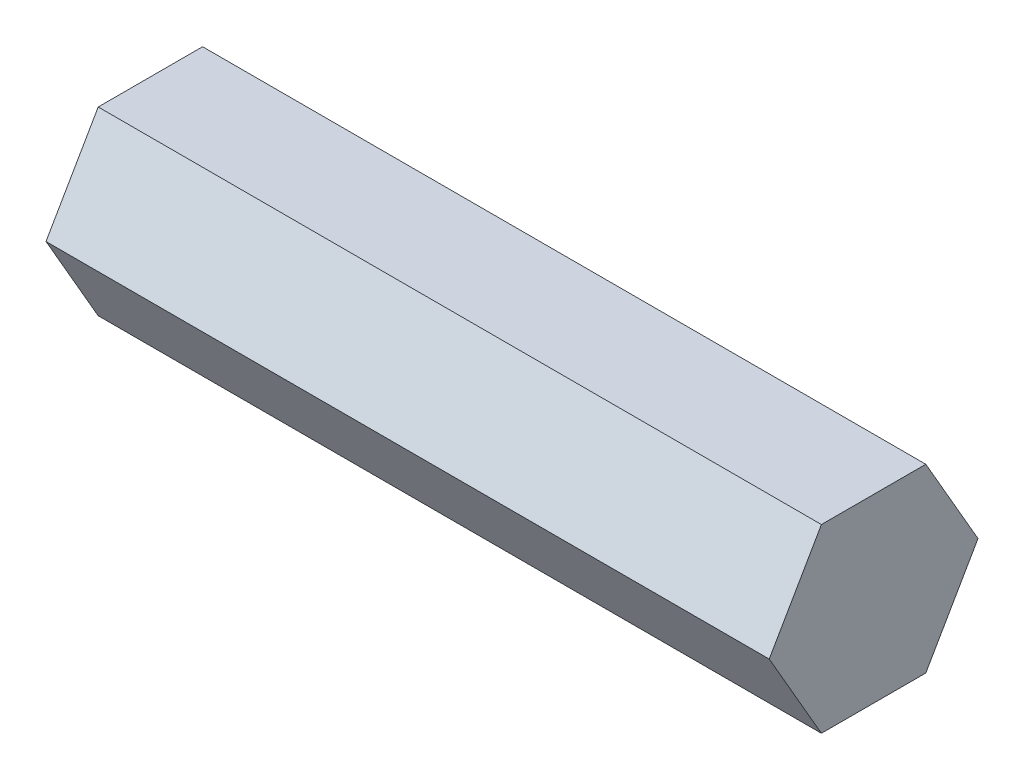
ISO-10303-21;
HEADER;
FILE_DESCRIPTION(('STEP AP214'),'2;1');
FILE_NAME('part.step','',(''),(''),'','','');
FILE_SCHEMA(('AUTOMOTIVE_DESIGN { 1 0 10303 214 1 1 1 1 }'));
ENDSEC;
DATA;
#1=APPLICATION_CONTEXT('core data for automotive mechanical design processes');
#2=APPLICATION_PROTOCOL_DEFINITION('international standard','automotive_design',2000,#1);
#3=PRODUCT_CONTEXT('',#1,'mechanical');
#4=PRODUCT('Part','Part','',(#3));
#5=PRODUCT_RELATED_PRODUCT_CATEGORY('part','',(#4));
#6=PRODUCT_DEFINITION_FORMATION('','',#4);
#7=PRODUCT_DEFINITION_CONTEXT('part definition',#1,'design');
#8=PRODUCT_DEFINITION('design','',#6,#7);
#9=PRODUCT_DEFINITION_SHAPE('','',#8);
#10=(LENGTH_UNIT() NAMED_UNIT(*) SI_UNIT(.MILLI.,.METRE.));
#11=(NAMED_UNIT(*) PLANE_ANGLE_UNIT() SI_UNIT($,.RADIAN.));
#12=(NAMED_UNIT(*) SI_UNIT($,.STERADIAN.) SOLID_ANGLE_UNIT());
#13=UNCERTAINTY_MEASURE_WITH_UNIT(LENGTH_MEASURE(1.E-05),#10,'distance_accuracy_value','');
#14=(GEOMETRIC_REPRESENTATION_CONTEXT(3) GLOBAL_UNCERTAINTY_ASSIGNED_CONTEXT((#13)) GLOBAL_UNIT_ASSIGNED_CONTEXT((#10,
#11,#12)) REPRESENTATION_CONTEXT('',''));
#15=CARTESIAN_POINT('',(0.,0.,0.));
#16=DIRECTION('',(0.,0.,1.));
#17=DIRECTION('',(1.,0.,0.));
#18=AXIS2_PLACEMENT_3D('',#15,#16,#17);
#19=CARTESIAN_POINT('',(50.8,-6.34999999999996,-3.6661742093542));
#20=DIRECTION('',(0.,0.499999999999995,0.866025403784442));
#21=DIRECTION('',(0.,-0.866025403784442,0.499999999999995));
#22=AXIS2_PLACEMENT_3D('',#19,#20,#21);
#23=PLANE('',#22);
#24=DIRECTION('',(0.,0.866025403784441,-0.499999999999995));
#25=VECTOR('',#24,1.);
#26=CARTESIAN_POINT('',(0.,-6.34999999999996,-3.6661742093542));
#27=LINE('',#26,#25);
#28=CARTESIAN_POINT('',(0.,-6.34999999999996,-3.6661742093542));
#29=VERTEX_POINT('',#28);
#30=CARTESIAN_POINT('',(0.,0.,-7.33234841870825));
#31=VERTEX_POINT('',#30);
#32=EDGE_CURVE('E121',#29,#31,#27,.T.);
#33=ORIENTED_EDGE('',*,*,#32,.T.);
#34=DIRECTION('',(-1.,0.,0.));
#35=VECTOR('',#34,1.);
#36=CARTESIAN_POINT('',(50.8,0.,-7.33234841870825));
#37=LINE('',#36,#35);
#38=CARTESIAN_POINT('',(50.8,0.,-7.33234841870825));
#39=VERTEX_POINT('',#38);
#40=EDGE_CURVE('E11',#39,#31,#37,.T.);
#41=ORIENTED_EDGE('',*,*,#40,.F.);
#42=DIRECTION('',(0.,0.866025403784441,-0.499999999999995));
#43=VECTOR('',#42,1.);
#44=CARTESIAN_POINT('',(50.8,-6.34999999999996,-3.6661742093542));
#45=LINE('',#44,#43);
#46=CARTESIAN_POINT('',(50.8,-6.34999999999996,-3.6661742093542));
#47=VERTEX_POINT('',#46);
#48=EDGE_CURVE('E131',#47,#39,#45,.T.);
#49=ORIENTED_EDGE('',*,*,#48,.F.);
#50=DIRECTION('',(-1.,0.,0.));
#51=VECTOR('',#50,1.);
#52=CARTESIAN_POINT('',(50.8,-6.34999999999996,-3.6661742093542));
#53=LINE('',#52,#51);
#54=EDGE_CURVE('E117',#47,#29,#53,.T.);
#55=ORIENTED_EDGE('',*,*,#54,.T.);
#56=EDGE_LOOP('',(#33,#41,#49,#55));
#57=FACE_BOUND('',#56,.T.);
#58=ADVANCED_FACE('F37',(#57),#23,.F.);
#59=CARTESIAN_POINT('',(50.8,0.,-7.33234841870825));
#60=DIRECTION('',(0.,-0.500000000000001,0.866025403784438));
#61=DIRECTION('',(0.,-0.866025403784438,-0.500000000000001));
#62=AXIS2_PLACEMENT_3D('',#59,#60,#61);
#63=PLANE('',#62);
#64=DIRECTION('',(0.,0.866025403784438,0.500000000000001));
#65=VECTOR('',#64,1.);
#66=CARTESIAN_POINT('',(0.,0.,-7.33234841870825));
#67=LINE('',#66,#65);
#68=CARTESIAN_POINT('',(0.,6.35000000000001,-3.66617420935411));
#69=VERTEX_POINT('',#68);
#70=EDGE_CURVE('E124',#31,#69,#67,.T.);
#71=ORIENTED_EDGE('',*,*,#70,.T.);
#72=DIRECTION('',(-1.,0.,0.));
#73=VECTOR('',#72,1.);
#74=CARTESIAN_POINT('',(50.8,6.35000000000001,-3.66617420935411));
#75=LINE('',#74,#73);
#76=CARTESIAN_POINT('',(50.8,6.35000000000001,-3.66617420935411));
#77=VERTEX_POINT('',#76);
#78=EDGE_CURVE('E45',#77,#69,#75,.T.);
#79=ORIENTED_EDGE('',*,*,#78,.F.);
#80=DIRECTION('',(0.,0.866025403784438,0.500000000000001));
#81=VECTOR('',#80,1.);
#82=CARTESIAN_POINT('',(50.8,0.,-7.33234841870825));
#83=LINE('',#82,#81);
#84=EDGE_CURVE('E90',#39,#77,#83,.T.);
#85=ORIENTED_EDGE('',*,*,#84,.F.);
#86=ORIENTED_EDGE('',*,*,#40,.T.);
#87=EDGE_LOOP('',(#71,#79,#85,#86));
#88=FACE_BOUND('',#87,.T.);
#89=ADVANCED_FACE('F155',(#88),#63,.F.);
#90=CARTESIAN_POINT('',(50.8,6.35000000000001,-3.66617420935411));
#91=DIRECTION('',(0.,-1.,0.));
#92=DIRECTION('',(0.,0.,-1.));
#93=AXIS2_PLACEMENT_3D('',#90,#91,#92);
#94=PLANE('',#93);
#95=DIRECTION('',(0.,0.,1.));
#96=VECTOR('',#95,1.);
#97=CARTESIAN_POINT('',(0.,6.35000000000001,-3.66617420935411));
#98=LINE('',#97,#96);
#99=CARTESIAN_POINT('',(0.,6.34999999999999,3.66617420935415));
#100=VERTEX_POINT('',#99);
#101=EDGE_CURVE('E126',#69,#100,#98,.T.);
#102=ORIENTED_EDGE('',*,*,#101,.T.);
#103=DIRECTION('',(-1.,0.,0.));
#104=VECTOR('',#103,1.);
#105=CARTESIAN_POINT('',(50.8,6.34999999999999,3.66617420935415));
#106=LINE('',#105,#104);
#107=CARTESIAN_POINT('',(50.8,6.34999999999999,3.66617420935415));
#108=VERTEX_POINT('',#107);
#109=EDGE_CURVE('E112',#108,#100,#106,.T.);
#110=ORIENTED_EDGE('',*,*,#109,.F.);
#111=DIRECTION('',(0.,0.,1.));
#112=VECTOR('',#111,1.);
#113=CARTESIAN_POINT('',(50.8,6.35000000000001,-3.66617420935411));
#114=LINE('',#113,#112);
#115=EDGE_CURVE('E103',#77,#108,#114,.T.);
#116=ORIENTED_EDGE('',*,*,#115,.F.);
#117=ORIENTED_EDGE('',*,*,#78,.T.);
#118=EDGE_LOOP('',(#102,#110,#116,#117));
#119=FACE_BOUND('',#118,.T.);
#120=ADVANCED_FACE('F137',(#119),#94,.F.);
#121=CARTESIAN_POINT('',(50.8,6.34999999999999,3.66617420935415));
#122=DIRECTION('',(0.,-0.499999999999995,-0.866025403784442));
#123=DIRECTION('',(0.,0.866025403784442,-0.499999999999995));
#124=AXIS2_PLACEMENT_3D('',#121,#122,#123);
#125=PLANE('',#124);
#126=DIRECTION('',(0.,-0.866025403784442,0.499999999999995));
#127=VECTOR('',#126,1.);
#128=CARTESIAN_POINT('',(0.,6.34999999999999,3.66617420935415));
#129=LINE('',#128,#127);
#130=CARTESIAN_POINT('',(0.,0.,7.33234841870825));
#131=VERTEX_POINT('',#130);
#132=EDGE_CURVE('E111',#100,#131,#129,.T.);
#133=ORIENTED_EDGE('',*,*,#132,.T.);
#134=DIRECTION('',(-1.,0.,0.));
#135=VECTOR('',#134,1.);
#136=CARTESIAN_POINT('',(50.8,0.,7.33234841870825));
#137=LINE('',#136,#135);
#138=CARTESIAN_POINT('',(50.8,0.,7.33234841870825));
#139=VERTEX_POINT('',#138);
#140=EDGE_CURVE('E108',#139,#131,#137,.T.);
#141=ORIENTED_EDGE('',*,*,#140,.F.);
#142=DIRECTION('',(0.,-0.866025403784442,0.499999999999995));
#143=VECTOR('',#142,1.);
#144=CARTESIAN_POINT('',(50.8,6.34999999999999,3.66617420935415));
#145=LINE('',#144,#143);
#146=EDGE_CURVE('E97',#108,#139,#145,.T.);
#147=ORIENTED_EDGE('',*,*,#146,.F.);
#148=ORIENTED_EDGE('',*,*,#109,.T.);
#149=EDGE_LOOP('',(#133,#141,#147,#148));
#150=FACE_BOUND('',#149,.T.);
#151=ADVANCED_FACE('F109',(#150),#125,.F.);
#152=CARTESIAN_POINT('',(50.8,0.,7.33234841870825));
#153=DIRECTION('',(0.,0.500000000000007,-0.866025403784435));
#154=DIRECTION('',(0.,0.866025403784435,0.500000000000007));
#155=AXIS2_PLACEMENT_3D('',#152,#153,#154);
#156=PLANE('',#155);
#157=DIRECTION('',(0.,-0.866025403784435,-0.500000000000007));
#158=VECTOR('',#157,1.);
#159=CARTESIAN_POINT('',(0.,0.,7.33234841870825));
#160=LINE('',#159,#158);
#161=CARTESIAN_POINT('',(0.,-6.35000000000004,3.66617420935407));
#162=VERTEX_POINT('',#161);
#163=EDGE_CURVE('E76',#131,#162,#160,.T.);
#164=ORIENTED_EDGE('',*,*,#163,.T.);
#165=DIRECTION('',(-1.,0.,0.));
#166=VECTOR('',#165,1.);
#167=CARTESIAN_POINT('',(50.8,-6.35000000000004,3.66617420935407));
#168=LINE('',#167,#166);
#169=CARTESIAN_POINT('',(50.8,-6.35000000000004,3.66617420935407));
#170=VERTEX_POINT('',#169);
#171=EDGE_CURVE('E113',#170,#162,#168,.T.);
#172=ORIENTED_EDGE('',*,*,#171,.F.);
#173=DIRECTION('',(0.,-0.866025403784435,-0.500000000000007));
#174=VECTOR('',#173,1.);
#175=CARTESIAN_POINT('',(50.8,0.,7.33234841870825));
#176=LINE('',#175,#174);
#177=EDGE_CURVE('E101',#139,#170,#176,.T.);
#178=ORIENTED_EDGE('',*,*,#177,.F.);
#179=ORIENTED_EDGE('',*,*,#140,.T.);
#180=EDGE_LOOP('',(#164,#172,#178,#179));
#181=FACE_BOUND('',#180,.T.);
#182=ADVANCED_FACE('F115',(#181),#156,.F.);
#183=CARTESIAN_POINT('',(50.8,-6.35000000000004,3.66617420935407));
#184=DIRECTION('',(0.,1.,0.));
#185=DIRECTION('',(0.,0.,1.));
#186=AXIS2_PLACEMENT_3D('',#183,#184,#185);
#187=PLANE('',#186);
#188=DIRECTION('',(0.,0.,-1.));
#189=VECTOR('',#188,1.);
#190=CARTESIAN_POINT('',(0.,-6.35000000000004,3.66617420935407));
#191=LINE('',#190,#189);
#192=EDGE_CURVE('E82',#162,#29,#191,.T.);
#193=ORIENTED_EDGE('',*,*,#192,.T.);
#194=ORIENTED_EDGE('',*,*,#54,.F.);
#195=DIRECTION('',(0.,0.,-1.));
#196=VECTOR('',#195,1.);
#197=CARTESIAN_POINT('',(50.8,-6.35000000000004,3.66617420935407));
#198=LINE('',#197,#196);
#199=EDGE_CURVE('E53',#170,#47,#198,.T.);
#200=ORIENTED_EDGE('',*,*,#199,.F.);
#201=ORIENTED_EDGE('',*,*,#171,.T.);
#202=EDGE_LOOP('',(#193,#194,#200,#201));
#203=FACE_BOUND('',#202,.T.);
#204=ADVANCED_FACE('F144',(#203),#187,.F.);
#205=CARTESIAN_POINT('',(50.8,0.,0.));
#206=DIRECTION('',(1.,0.,0.));
#207=DIRECTION('',(0.,0.,-1.));
#208=AXIS2_PLACEMENT_3D('',#205,#206,#207);
#209=PLANE('',#208);
#210=ORIENTED_EDGE('',*,*,#48,.T.);
#211=ORIENTED_EDGE('',*,*,#84,.T.);
#212=ORIENTED_EDGE('',*,*,#115,.T.);
#213=ORIENTED_EDGE('',*,*,#146,.T.);
#214=ORIENTED_EDGE('',*,*,#177,.T.);
#215=ORIENTED_EDGE('',*,*,#199,.T.);
#216=EDGE_LOOP('',(#210,#211,#212,#213,#214,#215));
#217=FACE_BOUND('',#216,.T.);
#218=ADVANCED_FACE('F99',(#217),#209,.T.);
#219=CARTESIAN_POINT('',(0.,0.,0.));
#220=DIRECTION('',(1.,0.,0.));
#221=DIRECTION('',(0.,0.,-1.));
#222=AXIS2_PLACEMENT_3D('',#219,#220,#221);
#223=PLANE('',#222);
#224=ORIENTED_EDGE('',*,*,#32,.F.);
#225=ORIENTED_EDGE('',*,*,#192,.F.);
#226=ORIENTED_EDGE('',*,*,#163,.F.);
#227=ORIENTED_EDGE('',*,*,#132,.F.);
#228=ORIENTED_EDGE('',*,*,#101,.F.);
#229=ORIENTED_EDGE('',*,*,#70,.F.);
#230=EDGE_LOOP('',(#224,#225,#226,#227,#228,#229));
#231=FACE_BOUND('',#230,.T.);
#232=ADVANCED_FACE('F140',(#231),#223,.F.);
#233=CLOSED_SHELL('',(#58,#89,#120,#151,#182,#204,#218,#232));
#234=MANIFOLD_SOLID_BREP('B2',#233);
#235=ADVANCED_BREP_SHAPE_REPRESENTATION('',(#18,#234),#14);
#236=SHAPE_DEFINITION_REPRESENTATION(#9,#235);
ENDSEC;
END-ISO-10303-21;
